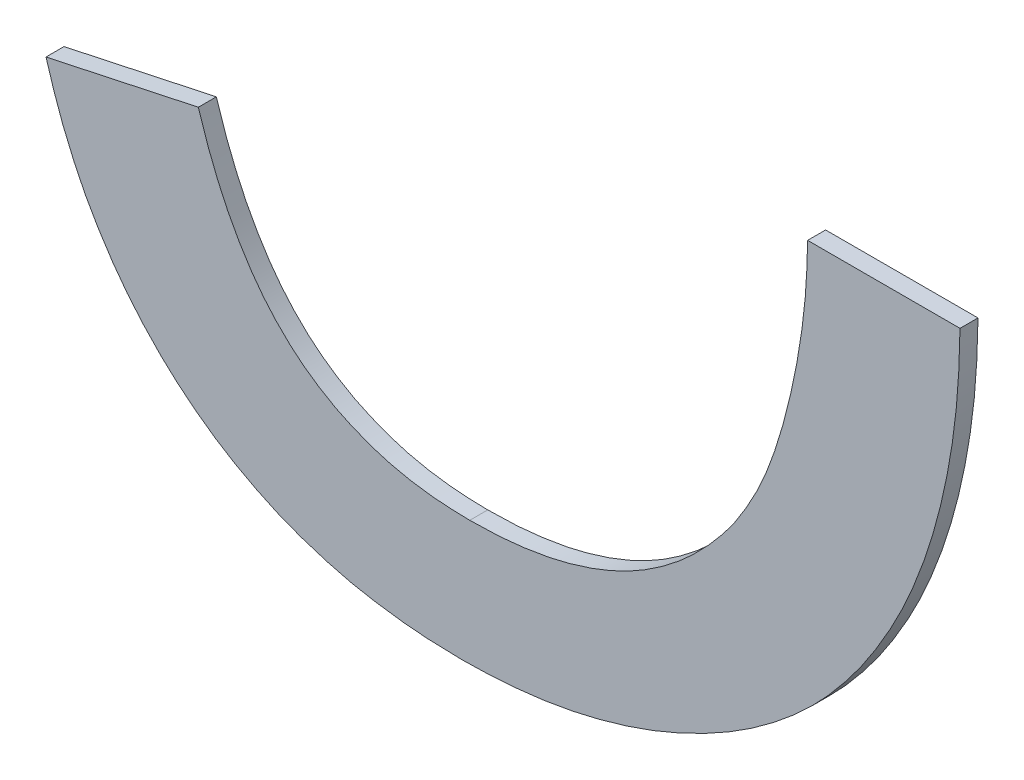
ISO-10303-21;
HEADER;
FILE_DESCRIPTION(('STEP AP214'),'2;1');
FILE_NAME('part.step','',(''),(''),'','','');
FILE_SCHEMA(('AUTOMOTIVE_DESIGN { 1 0 10303 214 1 1 1 1 }'));
ENDSEC;
DATA;
#1=APPLICATION_CONTEXT('core data for automotive mechanical design processes');
#2=APPLICATION_PROTOCOL_DEFINITION('international standard','automotive_design',2000,#1);
#3=PRODUCT_CONTEXT('',#1,'mechanical');
#4=PRODUCT('Part','Part','',(#3));
#5=PRODUCT_RELATED_PRODUCT_CATEGORY('part','',(#4));
#6=PRODUCT_DEFINITION_FORMATION('','',#4);
#7=PRODUCT_DEFINITION_CONTEXT('part definition',#1,'design');
#8=PRODUCT_DEFINITION('design','',#6,#7);
#9=PRODUCT_DEFINITION_SHAPE('','',#8);
#10=(LENGTH_UNIT() NAMED_UNIT(*) SI_UNIT(.MILLI.,.METRE.));
#11=(NAMED_UNIT(*) PLANE_ANGLE_UNIT() SI_UNIT($,.RADIAN.));
#12=(NAMED_UNIT(*) SI_UNIT($,.STERADIAN.) SOLID_ANGLE_UNIT());
#13=UNCERTAINTY_MEASURE_WITH_UNIT(LENGTH_MEASURE(1.E-05),#10,'distance_accuracy_value','');
#14=(GEOMETRIC_REPRESENTATION_CONTEXT(3) GLOBAL_UNCERTAINTY_ASSIGNED_CONTEXT((#13)) GLOBAL_UNIT_ASSIGNED_CONTEXT((#10,
#11,#12)) REPRESENTATION_CONTEXT('',''));
#15=CARTESIAN_POINT('',(0.,0.,0.));
#16=DIRECTION('',(0.,0.,1.));
#17=DIRECTION('',(1.,0.,0.));
#18=AXIS2_PLACEMENT_3D('',#15,#16,#17);
#19=CARTESIAN_POINT('',(-8.07692307692411,-5.75721153846153,0.5));
#20=CARTESIAN_POINT('',(-7.99384950323443,-6.01670333062294,0.5));
#21=CARTESIAN_POINT('',(-7.83124881515837,-6.52460905902151,0.5));
#22=CARTESIAN_POINT('',(-7.54232428833884,-7.24833083978457,0.5));
#23=CARTESIAN_POINT('',(-7.2310690546205,-7.9206759379094,0.5));
#24=CARTESIAN_POINT('',(-6.88719114007745,-8.5338599336471,0.5));
#25=CARTESIAN_POINT('',(-6.52142231460889,-9.0969343434726,0.5));
#26=CARTESIAN_POINT('',(-6.12397127905924,-9.60454733307746,0.5));
#27=CARTESIAN_POINT('',(-5.69599493216016,-10.0555245647492,0.5));
#28=CARTESIAN_POINT('',(-5.24403390868355,-10.4575781071608,0.5));
#29=CARTESIAN_POINT('',(-4.75696415105994,-10.7998545582529,0.5));
#30=CARTESIAN_POINT('',(-4.24517592495975,-11.1052891386496,0.5));
#31=CARTESIAN_POINT('',(-3.6965374159755,-11.3531745213206,0.5));
#32=CARTESIAN_POINT('',(-3.12362113128782,-11.5673505238898,0.5));
#33=CARTESIAN_POINT('',(-2.51977537623485,-11.7286914673409,0.5));
#34=CARTESIAN_POINT('',(-1.88661667862582,-11.8425123385942,0.5));
#35=CARTESIAN_POINT('',(-1.22334909416207,-11.9083105571161,0.5));
#36=CARTESIAN_POINT('',(-0.771378798265382,-11.918089484729,0.5));
#37=CARTESIAN_POINT('',(-0.540865384616418,-11.9230769230769,0.5));
#38=B_SPLINE_CURVE_WITH_KNOTS('',3,(#19,#20,#21,#22,#23,#24,#25,#26,#27,#28,#29,#30,#31,#32,#33,
#34,#35,#36,#37),.UNSPECIFIED.,.F.,.F.,(4,1,1,1,1,1,1,1,1,1,1,1,1,1,1,1,4),(0.,
0.0772155200915941,0.151134664603964,0.220740137080958,0.287091552318651,0.350248480000223,
0.410910522213975,0.469556324934489,0.526287682107932,0.582067526532238,0.638066614053209,
0.694979566512475,0.75247033025718,0.811289077185907,0.871881976722438,0.934657380885891,1.),.UNSPECIFIED.);
#39=DIRECTION('',(0.,0.,1.));
#40=VECTOR('',#39,1.);
#41=SURFACE_OF_LINEAR_EXTRUSION('',#38,#40);
#42=CARTESIAN_POINT('',(-8.07692307692411,-5.75721153846153,1.));
#43=CARTESIAN_POINT('',(-7.99384950323443,-6.01670333062294,1.));
#44=CARTESIAN_POINT('',(-7.83124881515837,-6.52460905902151,1.));
#45=CARTESIAN_POINT('',(-7.54232428833884,-7.24833083978457,1.));
#46=CARTESIAN_POINT('',(-7.2310690546205,-7.9206759379094,1.));
#47=CARTESIAN_POINT('',(-6.88719114007745,-8.5338599336471,1.));
#48=CARTESIAN_POINT('',(-6.52142231460889,-9.0969343434726,1.));
#49=CARTESIAN_POINT('',(-6.12397127905924,-9.60454733307746,1.));
#50=CARTESIAN_POINT('',(-5.69599493216016,-10.0555245647492,1.));
#51=CARTESIAN_POINT('',(-5.24403390868355,-10.4575781071608,1.));
#52=CARTESIAN_POINT('',(-4.75696415105994,-10.7998545582529,1.));
#53=CARTESIAN_POINT('',(-4.24517592495975,-11.1052891386496,1.));
#54=CARTESIAN_POINT('',(-3.6965374159755,-11.3531745213206,1.));
#55=CARTESIAN_POINT('',(-3.12362113128782,-11.5673505238898,1.));
#56=CARTESIAN_POINT('',(-2.51977537623485,-11.7286914673409,1.));
#57=CARTESIAN_POINT('',(-1.88661667862582,-11.8425123385942,1.));
#58=CARTESIAN_POINT('',(-1.22334909416207,-11.9083105571161,1.));
#59=CARTESIAN_POINT('',(-0.771378798265382,-11.918089484729,1.));
#60=CARTESIAN_POINT('',(-0.540865384616418,-11.9230769230769,1.));
#61=B_SPLINE_CURVE_WITH_KNOTS('',3,(#42,#43,#44,#45,#46,#47,#48,#49,#50,#51,#52,#53,#54,#55,#56,
#57,#58,#59,#60),.UNSPECIFIED.,.F.,.F.,(4,1,1,1,1,1,1,1,1,1,1,1,1,1,1,1,4),(0.,
0.0772155200915941,0.151134664603964,0.220740137080958,0.287091552318651,0.350248480000223,
0.410910522213975,0.469556324934489,0.526287682107932,0.582067526532238,0.638066614053209,
0.694979566512475,0.75247033025718,0.811289077185907,0.871881976722438,0.934657380885891,1.),.UNSPECIFIED.);
#62=CARTESIAN_POINT('',(-8.07692307692411,-5.75721153846153,1.));
#63=VERTEX_POINT('',#62);
#64=CARTESIAN_POINT('',(-0.540865384616418,-11.9230769230769,1.));
#65=VERTEX_POINT('',#64);
#66=EDGE_CURVE('E86',#63,#65,#61,.T.);
#67=ORIENTED_EDGE('',*,*,#66,.T.);
#68=DIRECTION('',(0.,0.,1.));
#69=VECTOR('',#68,1.);
#70=CARTESIAN_POINT('',(-0.540865384616418,-11.9230769230769,0.5));
#71=LINE('',#70,#69);
#72=CARTESIAN_POINT('',(-0.540865384616418,-11.9230769230769,0.5));
#73=VERTEX_POINT('',#72);
#74=EDGE_CURVE('E147',#73,#65,#71,.T.);
#75=ORIENTED_EDGE('',*,*,#74,.F.);
#76=CARTESIAN_POINT('',(-8.07692307692411,-5.75721153846153,0.5));
#77=VERTEX_POINT('',#76);
#78=EDGE_CURVE('E63',#77,#73,#38,.T.);
#79=ORIENTED_EDGE('',*,*,#78,.F.);
#80=DIRECTION('',(0.,0.,1.));
#81=VECTOR('',#80,1.);
#82=CARTESIAN_POINT('',(-8.07692307692411,-5.75721153846153,0.5));
#83=LINE('',#82,#81);
#84=EDGE_CURVE('E152',#77,#63,#83,.T.);
#85=ORIENTED_EDGE('',*,*,#84,.T.);
#86=EDGE_LOOP('',(#67,#75,#79,#85));
#87=FACE_BOUND('',#86,.T.);
#88=ADVANCED_FACE('F39',(#87),#41,.F.);
#89=CARTESIAN_POINT('',(-12.3076923076933,-6.66466346153846,0.5));
#90=DIRECTION('',(0.209718783574371,-0.977761745936139,0.));
#91=DIRECTION('',(0.977761745936139,0.209718783574371,0.));
#92=AXIS2_PLACEMENT_3D('',#89,#90,#91);
#93=PLANE('',#92);
#94=DIRECTION('',(0.977761745936139,0.209718783574371,0.));
#95=VECTOR('',#94,1.);
#96=CARTESIAN_POINT('',(-12.3076923076933,-6.66466346153846,1.));
#97=LINE('',#96,#95);
#98=CARTESIAN_POINT('',(-12.3076923076933,-6.66466346153846,1.));
#99=VERTEX_POINT('',#98);
#100=EDGE_CURVE('E117',#99,#63,#97,.T.);
#101=ORIENTED_EDGE('',*,*,#100,.T.);
#102=ORIENTED_EDGE('',*,*,#84,.F.);
#103=DIRECTION('',(0.977761745936139,0.209718783574371,0.));
#104=VECTOR('',#103,1.);
#105=CARTESIAN_POINT('',(-12.3076923076933,-6.66466346153846,0.5));
#106=LINE('',#105,#104);
#107=CARTESIAN_POINT('',(-12.3076923076933,-6.66466346153846,0.5));
#108=VERTEX_POINT('',#107);
#109=EDGE_CURVE('E162',#108,#77,#106,.T.);
#110=ORIENTED_EDGE('',*,*,#109,.F.);
#111=DIRECTION('',(0.,0.,1.));
#112=VECTOR('',#111,1.);
#113=CARTESIAN_POINT('',(-12.3076923076933,-6.66466346153846,0.5));
#114=LINE('',#113,#112);
#115=EDGE_CURVE('E154',#108,#99,#114,.T.);
#116=ORIENTED_EDGE('',*,*,#115,.T.);
#117=EDGE_LOOP('',(#101,#102,#110,#116));
#118=FACE_BOUND('',#117,.T.);
#119=ADVANCED_FACE('F176',(#118),#93,.F.);
#120=CARTESIAN_POINT('',(-0.745192307693342,-15.3846153846154,0.5));
#121=CARTESIAN_POINT('',(-1.10409081287484,-15.3781703786021,0.5));
#122=CARTESIAN_POINT('',(-1.80954136102374,-15.365502081133,0.5));
#123=CARTESIAN_POINT('',(-2.84514650686272,-15.2514494151521,0.5));
#124=CARTESIAN_POINT('',(-3.83990151840388,-15.084479897357,0.5));
#125=CARTESIAN_POINT('',(-4.78625281475077,-14.8259807697962,0.5));
#126=CARTESIAN_POINT('',(-5.69434546739704,-14.5117363771172,0.5));
#127=CARTESIAN_POINT('',(-6.55360778169812,-14.1099001774211,0.5));
#128=CARTESIAN_POINT('',(-7.37542450039791,-13.649496434324,0.5));
#129=CARTESIAN_POINT('',(-8.1452411966061,-13.1107213380076,0.5));
#130=CARTESIAN_POINT('',(-8.86749989486353,-12.512061659603,0.5));
#131=CARTESIAN_POINT('',(-9.52836324074382,-11.8459733356194,0.5));
#132=CARTESIAN_POINT('',(-10.140795547821,-11.1305316676492,0.5));
#133=CARTESIAN_POINT('',(-10.6862637566002,-10.3474832010745,0.5));
#134=CARTESIAN_POINT('',(-11.1882224696434,-9.51593094580799,0.5));
#135=CARTESIAN_POINT('',(-11.6189781725557,-8.61806088092358,0.5));
#136=CARTESIAN_POINT('',(-12.0015628597451,-7.66712912523481,0.5));
#137=CARTESIAN_POINT('',(-12.2044067046736,-7.00288727919276,0.5));
#138=CARTESIAN_POINT('',(-12.3076923076933,-6.66466346153846,0.5));
#139=B_SPLINE_CURVE_WITH_KNOTS('',3,(#120,#121,#122,#123,#124,#125,#126,#127,#128,#129,#130,
#131,#132,#133,#134,#135,#136,#137,#138),.UNSPECIFIED.,.F.,.F.,(4,1,1,1,1,1,1,1,1,1,1,1,1,1,1,1,
4),(0.,0.0686308886454063,0.13490080709688,0.199097552428735,0.261375116307732,
0.322337261799353,0.382689358956881,0.442577390205443,0.502318125396789,0.562175499857446,
0.621787052439807,0.681597798488281,0.742092062313847,0.804129844072371,0.867198157981573,
0.932378927544783,1.),.UNSPECIFIED.);
#140=DIRECTION('',(0.,0.,1.));
#141=VECTOR('',#140,1.);
#142=SURFACE_OF_LINEAR_EXTRUSION('',#139,#141);
#143=CARTESIAN_POINT('',(-0.745192307693342,-15.3846153846154,1.));
#144=CARTESIAN_POINT('',(-1.10409081287484,-15.3781703786021,1.));
#145=CARTESIAN_POINT('',(-1.80954136102374,-15.365502081133,1.));
#146=CARTESIAN_POINT('',(-2.84514650686272,-15.2514494151521,1.));
#147=CARTESIAN_POINT('',(-3.83990151840388,-15.084479897357,1.));
#148=CARTESIAN_POINT('',(-4.78625281475077,-14.8259807697962,1.));
#149=CARTESIAN_POINT('',(-5.69434546739704,-14.5117363771172,1.));
#150=CARTESIAN_POINT('',(-6.55360778169812,-14.1099001774211,1.));
#151=CARTESIAN_POINT('',(-7.37542450039791,-13.649496434324,1.));
#152=CARTESIAN_POINT('',(-8.1452411966061,-13.1107213380076,1.));
#153=CARTESIAN_POINT('',(-8.86749989486353,-12.512061659603,1.));
#154=CARTESIAN_POINT('',(-9.52836324074382,-11.8459733356194,1.));
#155=CARTESIAN_POINT('',(-10.140795547821,-11.1305316676492,1.));
#156=CARTESIAN_POINT('',(-10.6862637566002,-10.3474832010745,1.));
#157=CARTESIAN_POINT('',(-11.1882224696434,-9.51593094580799,1.));
#158=CARTESIAN_POINT('',(-11.6189781725557,-8.61806088092358,1.));
#159=CARTESIAN_POINT('',(-12.0015628597451,-7.66712912523481,1.));
#160=CARTESIAN_POINT('',(-12.2044067046736,-7.00288727919276,1.));
#161=CARTESIAN_POINT('',(-12.3076923076933,-6.66466346153846,1.));
#162=B_SPLINE_CURVE_WITH_KNOTS('',3,(#143,#144,#145,#146,#147,#148,#149,#150,#151,#152,#153,
#154,#155,#156,#157,#158,#159,#160,#161),.UNSPECIFIED.,.F.,.F.,(4,1,1,1,1,1,1,1,1,1,1,1,1,1,1,1,
4),(0.,0.0686308886454063,0.13490080709688,0.199097552428735,0.261375116307732,
0.322337261799353,0.382689358956881,0.442577390205443,0.502318125396789,0.562175499857446,
0.621787052439807,0.681597798488281,0.742092062313847,0.804129844072371,0.867198157981573,
0.932378927544783,1.),.UNSPECIFIED.);
#163=CARTESIAN_POINT('',(-0.745192307693342,-15.3846153846154,1.));
#164=VERTEX_POINT('',#163);
#165=EDGE_CURVE('E114',#164,#99,#162,.T.);
#166=ORIENTED_EDGE('',*,*,#165,.T.);
#167=ORIENTED_EDGE('',*,*,#115,.F.);
#168=CARTESIAN_POINT('',(-0.745192307693342,-15.3846153846154,0.5));
#169=VERTEX_POINT('',#168);
#170=EDGE_CURVE('E158',#169,#108,#139,.T.);
#171=ORIENTED_EDGE('',*,*,#170,.F.);
#172=DIRECTION('',(0.,0.,1.));
#173=VECTOR('',#172,1.);
#174=CARTESIAN_POINT('',(-0.745192307693342,-15.3846153846154,0.5));
#175=LINE('',#174,#173);
#176=EDGE_CURVE('E42',#169,#164,#175,.T.);
#177=ORIENTED_EDGE('',*,*,#176,.T.);
#178=EDGE_LOOP('',(#166,#167,#171,#177));
#179=FACE_BOUND('',#178,.T.);
#180=ADVANCED_FACE('F159',(#179),#142,.F.);
#181=CARTESIAN_POINT('',(-6.07885597286301,9.8212271315108,0.5));
#182=DIRECTION('',(0.,0.,-1.));
#183=DIRECTION('',(0.,1.,0.));
#184=AXIS2_PLACEMENT_3D('',#181,#182,#183);
#185=PLANE('',#184);
#186=DIRECTION('',(-1.,0.,0.));
#187=VECTOR('',#186,1.);
#188=CARTESIAN_POINT('',(-6.07885597286301,-0.5,0.500000000000224));
#189=LINE('',#188,#187);
#190=CARTESIAN_POINT('',(13.0718330793297,-0.500000000000489,0.5));
#191=VERTEX_POINT('',#190);
#192=CARTESIAN_POINT('',(8.84072367572526,-0.5,0.500000000000243));
#193=VERTEX_POINT('',#192);
#194=EDGE_CURVE('E189',#191,#193,#189,.T.);
#195=ORIENTED_EDGE('',*,*,#194,.F.);
#196=CARTESIAN_POINT('',(13.076923076922,-0.222355769230765,0.5));
#197=CARTESIAN_POINT('',(13.0701343593084,-0.603069428614798,0.5));
#198=CARTESIAN_POINT('',(13.0567215679379,-1.35526346228557,0.5));
#199=CARTESIAN_POINT('',(12.9810404023088,-2.46515491316223,0.5));
#200=CARTESIAN_POINT('',(12.8419374489023,-3.53630799637809,0.5));
#201=CARTESIAN_POINT('',(12.6491072737453,-4.56955657458917,0.5));
#202=CARTESIAN_POINT('',(12.4034346329403,-5.5671283841263,0.5));
#203=CARTESIAN_POINT('',(12.1043471961774,-6.52925891598815,0.5));
#204=CARTESIAN_POINT('',(11.7475480395627,-7.45203058855437,0.5));
#205=CARTESIAN_POINT('',(11.3423298416047,-8.33570553594159,0.5));
#206=CARTESIAN_POINT('',(10.8762361596408,-9.16944489813579,0.5));
#207=CARTESIAN_POINT('',(10.3746419558467,-9.9608431645263,0.5));
#208=CARTESIAN_POINT('',(9.81694638022717,-10.6938902600461,0.5));
#209=CARTESIAN_POINT('',(9.2236111125496,-11.3854009743054,0.5));
#210=CARTESIAN_POINT('',(8.57205653553015,-12.014154865126,0.5));
#211=CARTESIAN_POINT('',(7.87729829485088,-12.5948566927327,0.5));
#212=CARTESIAN_POINT('',(7.13824017890179,-13.1235132736131,0.5));
#213=CARTESIAN_POINT('',(6.35610651574567,-13.5983437854319,0.5));
#214=CARTESIAN_POINT('',(5.54063794214465,-14.0151268630591,0.5));
#215=CARTESIAN_POINT('',(4.7053720294965,-14.3846445184678,0.5));
#216=CARTESIAN_POINT('',(3.8470743184966,-14.6912969514262,0.5));
#217=CARTESIAN_POINT('',(2.96788393547474,-14.9438865743354,0.5));
#218=CARTESIAN_POINT('',(2.06895842648179,-15.1429161175917,0.5));
#219=CARTESIAN_POINT('',(1.1491500369214,-15.2796588964216,0.5));
#220=CARTESIAN_POINT('',(0.210005910034125,-15.3665904668642,0.5));
#221=CARTESIAN_POINT('',(-0.424488190568027,-15.3785635880078,0.5));
#222=CARTESIAN_POINT('',(-0.745192307693342,-15.3846153846154,0.5));
#223=B_SPLINE_CURVE_WITH_KNOTS('',3,(#196,#197,#198,#199,#200,#201,#202,#203,#204,#205,#206,
#207,#208,#209,#210,#211,#212,#213,#214,#215,#216,#217,#218,#219,#220,#221,#222),.UNSPECIFIED.,
.F.,.F.,(4,1,1,1,1,1,1,1,1,1,1,1,1,1,1,1,1,1,1,1,1,1,1,1,4),(0.,0.0494034837925919,
0.0976088060813527,0.14426069508102,0.189480010836613,0.233924718217651,0.277496649223967,
0.320120143315498,0.362219710109443,0.403522970811286,0.4439725323374,0.483689720066416,
0.522935457769752,0.562088122446328,0.601026221914443,0.640337323356649,0.679878055679325,
0.719636048748962,0.759092110396416,0.798310293934117,0.837798876905501,0.877720520445882,
0.917679379085781,0.958391162303247,1.),.UNSPECIFIED.);
#224=EDGE_CURVE('E95',#191,#169,#223,.T.);
#225=ORIENTED_EDGE('',*,*,#224,.T.);
#226=ORIENTED_EDGE('',*,*,#170,.T.);
#227=ORIENTED_EDGE('',*,*,#109,.T.);
#228=ORIENTED_EDGE('',*,*,#78,.T.);
#229=CARTESIAN_POINT('',(-0.540865384616418,-11.9230769230769,0.5));
#230=CARTESIAN_POINT('',(-0.276214755436623,-11.9192352821965,0.5));
#231=CARTESIAN_POINT('',(0.244274931697887,-11.9116799082829,0.5));
#232=CARTESIAN_POINT('',(1.00895027896474,-11.8290519602995,0.5));
#233=CARTESIAN_POINT('',(1.74325358317647,-11.7072176507036,0.5));
#234=CARTESIAN_POINT('',(2.4419472368948,-11.5249897476968,0.5));
#235=CARTESIAN_POINT('',(3.10550659423072,-11.2970478769602,0.5));
#236=CARTESIAN_POINT('',(3.73573903498338,-11.0193817056509,0.5));
#237=CARTESIAN_POINT('',(4.33343360790916,-10.6877272335843,0.5));
#238=CARTESIAN_POINT('',(4.89574460355373,-10.301973240706,0.5));
#239=CARTESIAN_POINT('',(5.42483081521471,-9.87864340158341,0.5));
#240=CARTESIAN_POINT('',(5.90573166147381,-9.41069975946114,0.5));
#241=CARTESIAN_POINT('',(6.35331894554214,-8.91644574184612,0.5));
#242=CARTESIAN_POINT('',(6.76435026892713,-8.38932008212962,0.5));
#243=CARTESIAN_POINT('',(7.12379930819318,-7.8184336405056,0.5));
#244=CARTESIAN_POINT('',(7.450412700332,-7.21762464881845,0.5));
#245=CARTESIAN_POINT('',(7.73191907834562,-6.57987205582056,0.5));
#246=CARTESIAN_POINT('',(8.05028096415872,-5.68548373806739,0.5));
#247=CARTESIAN_POINT('',(8.36323956957748,-4.53125654581314,0.5));
#248=CARTESIAN_POINT('',(8.64133408302618,-3.11970679928685,0.5));
#249=CARTESIAN_POINT('',(8.81668038053754,-1.68711393083122,0.5));
#250=CARTESIAN_POINT('',(8.83630858412379,-0.723647404415393,0.5));
#251=CARTESIAN_POINT('',(8.84615384615281,-0.240384615384611,0.5));
#252=B_SPLINE_CURVE_WITH_KNOTS('',3,(#229,#230,#231,#232,#233,#234,#235,#236,#237,#238,#239,
#240,#241,#242,#243,#244,#245,#246,#247,#248,#249,#250,#251),.UNSPECIFIED.,.F.,.F.,(4,1,1,1,1,1,
1,1,1,1,1,1,1,1,1,1,1,1,1,1,4),(0.,0.046759187987108,0.0919615237700393,0.13579379370334,
0.178217679518252,0.219424318515472,0.259689213277056,0.299788748429255,0.340053643190839,
0.380089035316147,0.419403977981836,0.458512701013065,0.497889776541508,0.537374952440318,
0.577614930804243,0.618670693423025,0.660446893756718,0.745319041730161,0.829758020265742,
0.91460874697686,1.),.UNSPECIFIED.);
#253=EDGE_CURVE('E123',#73,#193,#252,.T.);
#254=ORIENTED_EDGE('',*,*,#253,.T.);
#255=EDGE_LOOP('',(#195,#225,#226,#227,#228,#254));
#256=FACE_BOUND('',#255,.T.);
#257=ADVANCED_FACE('F172',(#256),#185,.T.);
#258=DIRECTION('',(0.,0.,1.));
#259=VECTOR('',#258,1.);
#260=SURFACE_OF_LINEAR_EXTRUSION('',#252,#259);
#261=CARTESIAN_POINT('',(-0.540865384616418,-11.9230769230769,1.));
#262=CARTESIAN_POINT('',(-0.276214755436623,-11.9192352821965,1.));
#263=CARTESIAN_POINT('',(0.244274931697887,-11.9116799082829,1.));
#264=CARTESIAN_POINT('',(1.00895027896474,-11.8290519602995,1.));
#265=CARTESIAN_POINT('',(1.74325358317647,-11.7072176507036,1.));
#266=CARTESIAN_POINT('',(2.4419472368948,-11.5249897476968,1.));
#267=CARTESIAN_POINT('',(3.10550659423072,-11.2970478769602,1.));
#268=CARTESIAN_POINT('',(3.73573903498338,-11.0193817056509,1.));
#269=CARTESIAN_POINT('',(4.33343360790916,-10.6877272335843,1.));
#270=CARTESIAN_POINT('',(4.89574460355373,-10.301973240706,1.));
#271=CARTESIAN_POINT('',(5.42483081521471,-9.87864340158341,1.));
#272=CARTESIAN_POINT('',(5.90573166147381,-9.41069975946114,1.));
#273=CARTESIAN_POINT('',(6.35331894554214,-8.91644574184612,1.));
#274=CARTESIAN_POINT('',(6.76435026892713,-8.38932008212962,1.));
#275=CARTESIAN_POINT('',(7.12379930819318,-7.8184336405056,1.));
#276=CARTESIAN_POINT('',(7.450412700332,-7.21762464881845,1.));
#277=CARTESIAN_POINT('',(7.73191907834562,-6.57987205582056,1.));
#278=CARTESIAN_POINT('',(8.05028096415872,-5.68548373806739,1.));
#279=CARTESIAN_POINT('',(8.36323956957748,-4.53125654581314,1.));
#280=CARTESIAN_POINT('',(8.64133408302618,-3.11970679928685,1.));
#281=CARTESIAN_POINT('',(8.81668038053754,-1.68711393083122,1.));
#282=CARTESIAN_POINT('',(8.83630858412379,-0.723647404415393,1.));
#283=CARTESIAN_POINT('',(8.84615384615281,-0.240384615384611,1.));
#284=B_SPLINE_CURVE_WITH_KNOTS('',3,(#261,#262,#263,#264,#265,#266,#267,#268,#269,#270,#271,
#272,#273,#274,#275,#276,#277,#278,#279,#280,#281,#282,#283),.UNSPECIFIED.,.F.,.F.,(4,1,1,1,1,1,
1,1,1,1,1,1,1,1,1,1,1,1,1,1,4),(0.,0.046759187987108,0.0919615237700393,0.13579379370334,
0.178217679518252,0.219424318515472,0.259689213277056,0.299788748429255,0.340053643190839,
0.380089035316147,0.419403977981836,0.458512701013065,0.497889776541508,0.537374952440318,
0.577614930804243,0.618670693423025,0.660446893756718,0.745319041730161,0.829758020265742,
0.91460874697686,1.),.UNSPECIFIED.);
#285=CARTESIAN_POINT('',(8.84072367572526,-0.5,1.));
#286=VERTEX_POINT('',#285);
#287=EDGE_CURVE('E137',#65,#286,#284,.T.);
#288=ORIENTED_EDGE('',*,*,#287,.T.);
#289=DIRECTION('',(0.,0.,1.));
#290=VECTOR('',#289,1.);
#291=CARTESIAN_POINT('',(8.84072367572535,-0.500000000000002,0.5));
#292=LINE('',#291,#290);
#293=EDGE_CURVE('E105',#286,#193,#292,.F.);
#294=ORIENTED_EDGE('',*,*,#293,.T.);
#295=ORIENTED_EDGE('',*,*,#253,.F.);
#296=ORIENTED_EDGE('',*,*,#74,.T.);
#297=EDGE_LOOP('',(#288,#294,#295,#296));
#298=FACE_BOUND('',#297,.T.);
#299=ADVANCED_FACE('F181',(#298),#260,.F.);
#300=DIRECTION('',(0.,0.,1.));
#301=VECTOR('',#300,1.);
#302=SURFACE_OF_LINEAR_EXTRUSION('',#223,#301);
#303=ORIENTED_EDGE('',*,*,#224,.F.);
#304=DIRECTION('',(0.,0.,1.));
#305=VECTOR('',#304,1.);
#306=CARTESIAN_POINT('',(13.0718330793297,-0.5,0.5));
#307=LINE('',#306,#305);
#308=CARTESIAN_POINT('',(13.0718330793297,-0.5,1.));
#309=VERTEX_POINT('',#308);
#310=EDGE_CURVE('E57',#191,#309,#307,.T.);
#311=ORIENTED_EDGE('',*,*,#310,.T.);
#312=CARTESIAN_POINT('',(13.076923076922,-0.222355769230765,1.));
#313=CARTESIAN_POINT('',(13.0701343593084,-0.603069428614798,1.));
#314=CARTESIAN_POINT('',(13.0567215679379,-1.35526346228557,1.));
#315=CARTESIAN_POINT('',(12.9810404023088,-2.46515491316223,1.));
#316=CARTESIAN_POINT('',(12.8419374489023,-3.53630799637809,1.));
#317=CARTESIAN_POINT('',(12.6491072737453,-4.56955657458917,1.));
#318=CARTESIAN_POINT('',(12.4034346329403,-5.5671283841263,1.));
#319=CARTESIAN_POINT('',(12.1043471961774,-6.52925891598815,1.));
#320=CARTESIAN_POINT('',(11.7475480395627,-7.45203058855437,1.));
#321=CARTESIAN_POINT('',(11.3423298416047,-8.33570553594159,1.));
#322=CARTESIAN_POINT('',(10.8762361596408,-9.16944489813579,1.));
#323=CARTESIAN_POINT('',(10.3746419558467,-9.9608431645263,1.));
#324=CARTESIAN_POINT('',(9.81694638022717,-10.6938902600461,1.));
#325=CARTESIAN_POINT('',(9.2236111125496,-11.3854009743054,1.));
#326=CARTESIAN_POINT('',(8.57205653553015,-12.014154865126,1.));
#327=CARTESIAN_POINT('',(7.87729829485088,-12.5948566927327,1.));
#328=CARTESIAN_POINT('',(7.13824017890179,-13.1235132736131,1.));
#329=CARTESIAN_POINT('',(6.35610651574567,-13.5983437854319,1.));
#330=CARTESIAN_POINT('',(5.54063794214465,-14.0151268630591,1.));
#331=CARTESIAN_POINT('',(4.7053720294965,-14.3846445184678,1.));
#332=CARTESIAN_POINT('',(3.8470743184966,-14.6912969514262,1.));
#333=CARTESIAN_POINT('',(2.96788393547474,-14.9438865743354,1.));
#334=CARTESIAN_POINT('',(2.06895842648179,-15.1429161175917,1.));
#335=CARTESIAN_POINT('',(1.1491500369214,-15.2796588964216,1.));
#336=CARTESIAN_POINT('',(0.210005910034125,-15.3665904668642,1.));
#337=CARTESIAN_POINT('',(-0.424488190568027,-15.3785635880078,1.));
#338=CARTESIAN_POINT('',(-0.745192307693342,-15.3846153846154,1.));
#339=B_SPLINE_CURVE_WITH_KNOTS('',3,(#312,#313,#314,#315,#316,#317,#318,#319,#320,#321,#322,
#323,#324,#325,#326,#327,#328,#329,#330,#331,#332,#333,#334,#335,#336,#337,#338),.UNSPECIFIED.,
.F.,.F.,(4,1,1,1,1,1,1,1,1,1,1,1,1,1,1,1,1,1,1,1,1,1,1,1,4),(0.,0.0494034837925919,
0.0976088060813527,0.14426069508102,0.189480010836613,0.233924718217651,0.277496649223967,
0.320120143315498,0.362219710109443,0.403522970811286,0.4439725323374,0.483689720066416,
0.522935457769752,0.562088122446328,0.601026221914443,0.640337323356649,0.679878055679325,
0.719636048748962,0.759092110396416,0.798310293934117,0.837798876905501,0.877720520445882,
0.917679379085781,0.958391162303247,1.),.UNSPECIFIED.);
#340=EDGE_CURVE('E110',#309,#164,#339,.T.);
#341=ORIENTED_EDGE('',*,*,#340,.T.);
#342=ORIENTED_EDGE('',*,*,#176,.F.);
#343=EDGE_LOOP('',(#303,#311,#341,#342));
#344=FACE_BOUND('',#343,.T.);
#345=ADVANCED_FACE('F41',(#344),#302,.F.);
#346=CARTESIAN_POINT('',(-6.07885597286301,9.8212271315108,1.));
#347=DIRECTION('',(0.,0.,-1.));
#348=DIRECTION('',(0.,1.,0.));
#349=AXIS2_PLACEMENT_3D('',#346,#347,#348);
#350=PLANE('',#349);
#351=ORIENTED_EDGE('',*,*,#340,.F.);
#352=DIRECTION('',(-1.,0.,0.));
#353=VECTOR('',#352,1.);
#354=CARTESIAN_POINT('',(-17.,-0.5,1.));
#355=LINE('',#354,#353);
#356=EDGE_CURVE('E11',#309,#286,#355,.T.);
#357=ORIENTED_EDGE('',*,*,#356,.T.);
#358=ORIENTED_EDGE('',*,*,#287,.F.);
#359=ORIENTED_EDGE('',*,*,#66,.F.);
#360=ORIENTED_EDGE('',*,*,#100,.F.);
#361=ORIENTED_EDGE('',*,*,#165,.F.);
#362=EDGE_LOOP('',(#351,#357,#358,#359,#360,#361));
#363=FACE_BOUND('',#362,.T.);
#364=ADVANCED_FACE('F115',(#363),#350,.F.);
#365=CARTESIAN_POINT('',(-17.,-0.5,1.));
#366=DIRECTION('',(0.,-1.,0.));
#367=DIRECTION('',(0.,0.,-1.));
#368=AXIS2_PLACEMENT_3D('',#365,#366,#367);
#369=PLANE('',#368);
#370=ORIENTED_EDGE('',*,*,#194,.T.);
#371=ORIENTED_EDGE('',*,*,#293,.F.);
#372=ORIENTED_EDGE('',*,*,#356,.F.);
#373=ORIENTED_EDGE('',*,*,#310,.F.);
#374=EDGE_LOOP('',(#370,#371,#372,#373));
#375=FACE_BOUND('',#374,.T.);
#376=ADVANCED_FACE('F99',(#375),#369,.F.);
#377=CLOSED_SHELL('',(#88,#119,#180,#257,#299,#345,#364,#376));
#378=MANIFOLD_SOLID_BREP('B2',#377);
#379=ADVANCED_BREP_SHAPE_REPRESENTATION('',(#18,#378),#14);
#380=SHAPE_DEFINITION_REPRESENTATION(#9,#379);
ENDSEC;
END-ISO-10303-21;
